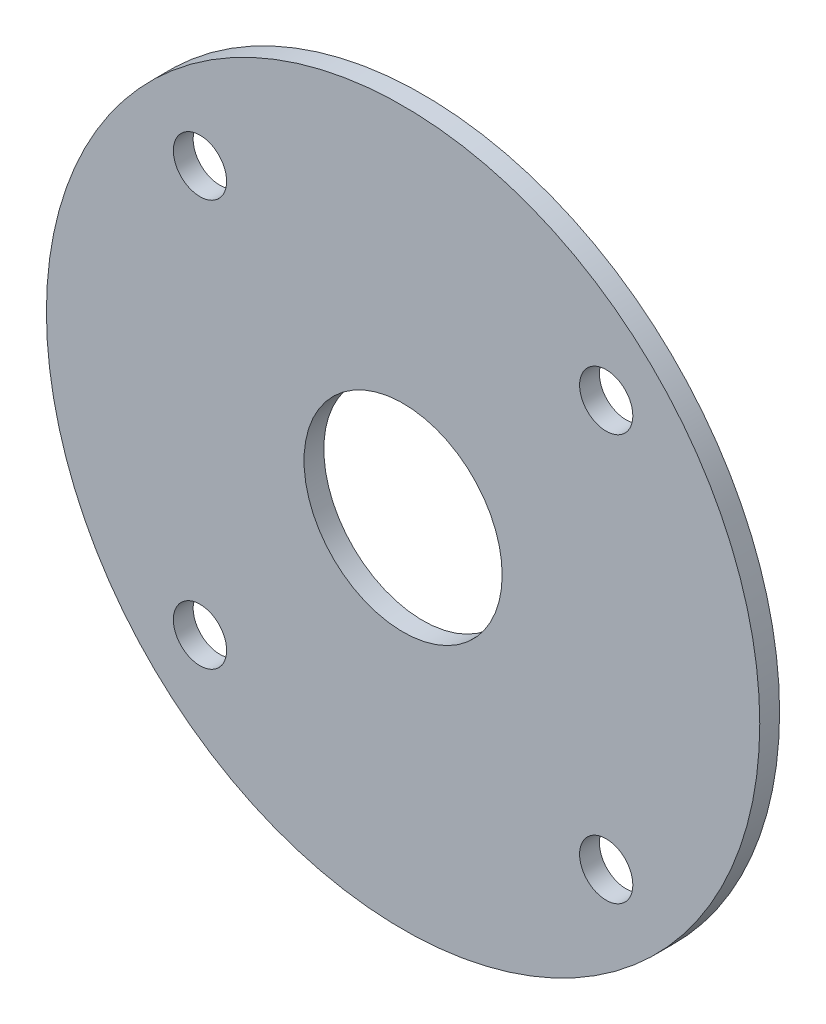
ISO-10303-21;
HEADER;
FILE_DESCRIPTION(('STEP AP214'),'2;1');
FILE_NAME('part.step','',(''),(''),'','','');
FILE_SCHEMA(('AUTOMOTIVE_DESIGN { 1 0 10303 214 1 1 1 1 }'));
ENDSEC;
DATA;
#1=APPLICATION_CONTEXT('core data for automotive mechanical design processes');
#2=APPLICATION_PROTOCOL_DEFINITION('international standard','automotive_design',2000,#1);
#3=PRODUCT_CONTEXT('',#1,'mechanical');
#4=PRODUCT('Part','Part','',(#3));
#5=PRODUCT_RELATED_PRODUCT_CATEGORY('part','',(#4));
#6=PRODUCT_DEFINITION_FORMATION('','',#4);
#7=PRODUCT_DEFINITION_CONTEXT('part definition',#1,'design');
#8=PRODUCT_DEFINITION('design','',#6,#7);
#9=PRODUCT_DEFINITION_SHAPE('','',#8);
#10=(LENGTH_UNIT() NAMED_UNIT(*) SI_UNIT(.MILLI.,.METRE.));
#11=(NAMED_UNIT(*) PLANE_ANGLE_UNIT() SI_UNIT($,.RADIAN.));
#12=(NAMED_UNIT(*) SI_UNIT($,.STERADIAN.) SOLID_ANGLE_UNIT());
#13=UNCERTAINTY_MEASURE_WITH_UNIT(LENGTH_MEASURE(1.E-05),#10,'distance_accuracy_value','');
#14=(GEOMETRIC_REPRESENTATION_CONTEXT(3) GLOBAL_UNCERTAINTY_ASSIGNED_CONTEXT((#13)) GLOBAL_UNIT_ASSIGNED_CONTEXT((#10,
#11,#12)) REPRESENTATION_CONTEXT('',''));
#15=CARTESIAN_POINT('',(0.,0.,0.));
#16=DIRECTION('',(0.,0.,1.));
#17=DIRECTION('',(1.,0.,0.));
#18=AXIS2_PLACEMENT_3D('',#15,#16,#17);
#19=CARTESIAN_POINT('',(0.,0.,6.35));
#20=DIRECTION('',(0.,0.,1.));
#21=DIRECTION('',(1.,0.,0.));
#22=AXIS2_PLACEMENT_3D('',#19,#20,#21);
#23=PLANE('',#22);
#24=CARTESIAN_POINT('',(65.0874999999996,-65.0875000000005,6.35));
#25=DIRECTION('',(0.,0.,1.));
#26=DIRECTION('',(1.,0.,0.));
#27=AXIS2_PLACEMENT_3D('',#24,#25,#26);
#28=CIRCLE('',#27,8.53281250000001);
#29=CARTESIAN_POINT('',(73.6203124999996,-65.0875000000005,6.35));
#30=VERTEX_POINT('',#29);
#31=EDGE_CURVE('E68',#30,#30,#28,.T.);
#32=ORIENTED_EDGE('',*,*,#31,.F.);
#33=EDGE_LOOP('',(#32));
#34=FACE_BOUND('',#33,.T.);
#35=CARTESIAN_POINT('',(65.0875000000002,65.0874999999998,6.35));
#36=DIRECTION('',(0.,0.,1.));
#37=DIRECTION('',(1.,0.,0.));
#38=AXIS2_PLACEMENT_3D('',#35,#36,#37);
#39=CIRCLE('',#38,8.53281250000001);
#40=CARTESIAN_POINT('',(73.6203125000002,65.0874999999998,6.35));
#41=VERTEX_POINT('',#40);
#42=EDGE_CURVE('E62',#41,#41,#39,.T.);
#43=ORIENTED_EDGE('',*,*,#42,.F.);
#44=EDGE_LOOP('',(#43));
#45=FACE_BOUND('',#44,.T.);
#46=CARTESIAN_POINT('',(-65.0875,65.0875,6.35));
#47=DIRECTION('',(0.,0.,1.));
#48=DIRECTION('',(1.,0.,0.));
#49=AXIS2_PLACEMENT_3D('',#46,#47,#48);
#50=CIRCLE('',#49,8.5328125);
#51=CARTESIAN_POINT('',(-56.5546875,65.0875,6.35));
#52=VERTEX_POINT('',#51);
#53=EDGE_CURVE('E56',#52,#52,#50,.T.);
#54=ORIENTED_EDGE('',*,*,#53,.F.);
#55=EDGE_LOOP('',(#54));
#56=FACE_BOUND('',#55,.T.);
#57=CARTESIAN_POINT('',(-65.0875000000007,-65.0874999999993,6.35));
#58=DIRECTION('',(0.,0.,1.));
#59=DIRECTION('',(1.,0.,0.));
#60=AXIS2_PLACEMENT_3D('',#57,#58,#59);
#61=CIRCLE('',#60,8.53281250000001);
#62=CARTESIAN_POINT('',(-56.5546875000007,-65.0874999999993,6.35));
#63=VERTEX_POINT('',#62);
#64=EDGE_CURVE('E50',#63,#63,#61,.T.);
#65=ORIENTED_EDGE('',*,*,#64,.F.);
#66=EDGE_LOOP('',(#65));
#67=FACE_BOUND('',#66,.T.);
#68=CARTESIAN_POINT('',(0.,0.,6.35));
#69=DIRECTION('',(0.,0.,1.));
#70=DIRECTION('',(1.,0.,0.));
#71=AXIS2_PLACEMENT_3D('',#68,#69,#70);
#72=CIRCLE('',#71,114.3);
#73=CARTESIAN_POINT('',(114.3,0.,6.35));
#74=VERTEX_POINT('',#73);
#75=EDGE_CURVE('E10',#74,#74,#72,.T.);
#76=ORIENTED_EDGE('',*,*,#75,.T.);
#77=EDGE_LOOP('',(#76));
#78=FACE_BOUND('',#77,.T.);
#79=CARTESIAN_POINT('',(0.,0.,6.35));
#80=DIRECTION('',(0.,0.,1.));
#81=DIRECTION('',(1.,0.,0.));
#82=AXIS2_PLACEMENT_3D('',#79,#80,#81);
#83=CIRCLE('',#82,31.75);
#84=CARTESIAN_POINT('',(31.75,0.,6.35));
#85=VERTEX_POINT('',#84);
#86=EDGE_CURVE('E40',#85,#85,#83,.T.);
#87=ORIENTED_EDGE('',*,*,#86,.F.);
#88=EDGE_LOOP('',(#87));
#89=FACE_BOUND('',#88,.T.);
#90=ADVANCED_FACE('F29',(#34,#45,#56,#67,#78,#89),#23,.T.);
#91=CARTESIAN_POINT('',(0.,0.,0.));
#92=DIRECTION('',(0.,0.,1.));
#93=DIRECTION('',(1.,0.,0.));
#94=AXIS2_PLACEMENT_3D('',#91,#92,#93);
#95=PLANE('',#94);
#96=CARTESIAN_POINT('',(65.0874999999996,-65.0875000000005,0.));
#97=DIRECTION('',(0.,0.,1.));
#98=DIRECTION('',(1.,0.,0.));
#99=AXIS2_PLACEMENT_3D('',#96,#97,#98);
#100=CIRCLE('',#99,8.53281250000001);
#101=CARTESIAN_POINT('',(73.6203124999996,-65.0875000000005,0.));
#102=VERTEX_POINT('',#101);
#103=EDGE_CURVE('E65',#102,#102,#100,.F.);
#104=ORIENTED_EDGE('',*,*,#103,.F.);
#105=EDGE_LOOP('',(#104));
#106=FACE_BOUND('',#105,.T.);
#107=CARTESIAN_POINT('',(65.0875000000002,65.0874999999998,0.));
#108=DIRECTION('',(0.,0.,1.));
#109=DIRECTION('',(1.,0.,0.));
#110=AXIS2_PLACEMENT_3D('',#107,#108,#109);
#111=CIRCLE('',#110,8.53281250000001);
#112=CARTESIAN_POINT('',(73.6203125000002,65.0874999999998,0.));
#113=VERTEX_POINT('',#112);
#114=EDGE_CURVE('E59',#113,#113,#111,.F.);
#115=ORIENTED_EDGE('',*,*,#114,.F.);
#116=EDGE_LOOP('',(#115));
#117=FACE_BOUND('',#116,.T.);
#118=CARTESIAN_POINT('',(-65.0875,65.0875,0.));
#119=DIRECTION('',(0.,0.,1.));
#120=DIRECTION('',(1.,0.,0.));
#121=AXIS2_PLACEMENT_3D('',#118,#119,#120);
#122=CIRCLE('',#121,8.5328125);
#123=CARTESIAN_POINT('',(-56.5546875,65.0875,0.));
#124=VERTEX_POINT('',#123);
#125=EDGE_CURVE('E53',#124,#124,#122,.F.);
#126=ORIENTED_EDGE('',*,*,#125,.F.);
#127=EDGE_LOOP('',(#126));
#128=FACE_BOUND('',#127,.T.);
#129=CARTESIAN_POINT('',(-65.0875000000007,-65.0874999999993,0.));
#130=DIRECTION('',(0.,0.,1.));
#131=DIRECTION('',(1.,0.,0.));
#132=AXIS2_PLACEMENT_3D('',#129,#130,#131);
#133=CIRCLE('',#132,8.53281250000001);
#134=CARTESIAN_POINT('',(-56.5546875000007,-65.0874999999993,0.));
#135=VERTEX_POINT('',#134);
#136=EDGE_CURVE('E45',#135,#135,#133,.F.);
#137=ORIENTED_EDGE('',*,*,#136,.F.);
#138=EDGE_LOOP('',(#137));
#139=FACE_BOUND('',#138,.T.);
#140=CARTESIAN_POINT('',(0.,0.,0.));
#141=DIRECTION('',(0.,0.,1.));
#142=DIRECTION('',(1.,0.,0.));
#143=AXIS2_PLACEMENT_3D('',#140,#141,#142);
#144=CIRCLE('',#143,114.3);
#145=CARTESIAN_POINT('',(114.3,0.,0.));
#146=VERTEX_POINT('',#145);
#147=EDGE_CURVE('E33',#146,#146,#144,.T.);
#148=ORIENTED_EDGE('',*,*,#147,.F.);
#149=EDGE_LOOP('',(#148));
#150=FACE_BOUND('',#149,.T.);
#151=CARTESIAN_POINT('',(0.,0.,0.));
#152=DIRECTION('',(0.,0.,1.));
#153=DIRECTION('',(1.,0.,0.));
#154=AXIS2_PLACEMENT_3D('',#151,#152,#153);
#155=CIRCLE('',#154,31.75);
#156=CARTESIAN_POINT('',(31.75,0.,0.));
#157=VERTEX_POINT('',#156);
#158=EDGE_CURVE('E42',#157,#157,#155,.T.);
#159=ORIENTED_EDGE('',*,*,#158,.T.);
#160=EDGE_LOOP('',(#159));
#161=FACE_BOUND('',#160,.T.);
#162=ADVANCED_FACE('F77',(#106,#117,#128,#139,#150,#161),#95,.F.);
#163=CARTESIAN_POINT('',(0.,0.,6.35));
#164=DIRECTION('',(0.,0.,-1.));
#165=DIRECTION('',(-1.,0.,0.));
#166=AXIS2_PLACEMENT_3D('',#163,#164,#165);
#167=CYLINDRICAL_SURFACE('',#166,114.3);
#168=ORIENTED_EDGE('',*,*,#75,.F.);
#169=EDGE_LOOP('',(#168));
#170=FACE_BOUND('',#169,.T.);
#171=ORIENTED_EDGE('',*,*,#147,.T.);
#172=EDGE_LOOP('',(#171));
#173=FACE_BOUND('',#172,.T.);
#174=ADVANCED_FACE('F31',(#170,#173),#167,.T.);
#175=CARTESIAN_POINT('',(0.,0.,6.35));
#176=DIRECTION('',(0.,0.,-1.));
#177=DIRECTION('',(-1.,0.,0.));
#178=AXIS2_PLACEMENT_3D('',#175,#176,#177);
#179=CYLINDRICAL_SURFACE('',#178,31.75);
#180=ORIENTED_EDGE('',*,*,#86,.T.);
#181=EDGE_LOOP('',(#180));
#182=FACE_BOUND('',#181,.T.);
#183=ORIENTED_EDGE('',*,*,#158,.F.);
#184=EDGE_LOOP('',(#183));
#185=FACE_BOUND('',#184,.T.);
#186=ADVANCED_FACE('F87',(#182,#185),#179,.F.);
#187=CARTESIAN_POINT('',(-65.0875000000007,-65.0874999999993,-0.00100000000000013));
#188=DIRECTION('',(0.,0.,1.));
#189=DIRECTION('',(1.,0.,0.));
#190=AXIS2_PLACEMENT_3D('',#187,#188,#189);
#191=CYLINDRICAL_SURFACE('',#190,8.53281250000001);
#192=ORIENTED_EDGE('',*,*,#64,.T.);
#193=EDGE_LOOP('',(#192));
#194=FACE_BOUND('',#193,.T.);
#195=ORIENTED_EDGE('',*,*,#136,.T.);
#196=EDGE_LOOP('',(#195));
#197=FACE_BOUND('',#196,.T.);
#198=ADVANCED_FACE('F90',(#194,#197),#191,.F.);
#199=CARTESIAN_POINT('',(-65.0875,65.0875,-0.00100000000000013));
#200=DIRECTION('',(0.,0.,1.));
#201=DIRECTION('',(1.,0.,0.));
#202=AXIS2_PLACEMENT_3D('',#199,#200,#201);
#203=CYLINDRICAL_SURFACE('',#202,8.5328125);
#204=ORIENTED_EDGE('',*,*,#53,.T.);
#205=EDGE_LOOP('',(#204));
#206=FACE_BOUND('',#205,.T.);
#207=ORIENTED_EDGE('',*,*,#125,.T.);
#208=EDGE_LOOP('',(#207));
#209=FACE_BOUND('',#208,.T.);
#210=ADVANCED_FACE('F105',(#206,#209),#203,.F.);
#211=CARTESIAN_POINT('',(65.0875000000002,65.0874999999998,-0.00100000000000013));
#212=DIRECTION('',(0.,0.,1.));
#213=DIRECTION('',(1.,0.,0.));
#214=AXIS2_PLACEMENT_3D('',#211,#212,#213);
#215=CYLINDRICAL_SURFACE('',#214,8.53281250000001);
#216=ORIENTED_EDGE('',*,*,#42,.T.);
#217=EDGE_LOOP('',(#216));
#218=FACE_BOUND('',#217,.T.);
#219=ORIENTED_EDGE('',*,*,#114,.T.);
#220=EDGE_LOOP('',(#219));
#221=FACE_BOUND('',#220,.T.);
#222=ADVANCED_FACE('F109',(#218,#221),#215,.F.);
#223=CARTESIAN_POINT('',(65.0874999999996,-65.0875000000005,-0.00100000000000013));
#224=DIRECTION('',(0.,0.,1.));
#225=DIRECTION('',(1.,0.,0.));
#226=AXIS2_PLACEMENT_3D('',#223,#224,#225);
#227=CYLINDRICAL_SURFACE('',#226,8.53281250000001);
#228=ORIENTED_EDGE('',*,*,#31,.T.);
#229=EDGE_LOOP('',(#228));
#230=FACE_BOUND('',#229,.T.);
#231=ORIENTED_EDGE('',*,*,#103,.T.);
#232=EDGE_LOOP('',(#231));
#233=FACE_BOUND('',#232,.T.);
#234=ADVANCED_FACE('F72',(#230,#233),#227,.F.);
#235=CLOSED_SHELL('',(#90,#162,#174,#186,#198,#210,#222,#234));
#236=MANIFOLD_SOLID_BREP('B2',#235);
#237=ADVANCED_BREP_SHAPE_REPRESENTATION('',(#18,#236),#14);
#238=SHAPE_DEFINITION_REPRESENTATION(#9,#237);
ENDSEC;
END-ISO-10303-21;
